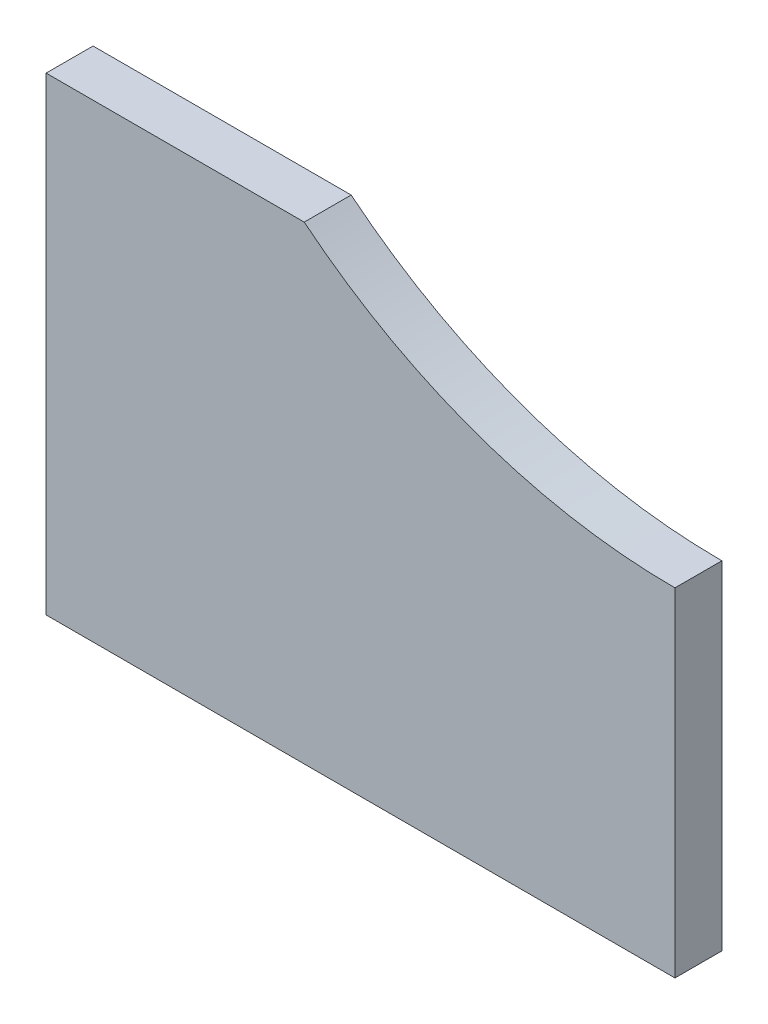
ISO-10303-21;
HEADER;
FILE_DESCRIPTION(('STEP AP214'),'2;1');
FILE_NAME('part.step','',(''),(''),'','','');
FILE_SCHEMA(('AUTOMOTIVE_DESIGN { 1 0 10303 214 1 1 1 1 }'));
ENDSEC;
DATA;
#1=APPLICATION_CONTEXT('core data for automotive mechanical design processes');
#2=APPLICATION_PROTOCOL_DEFINITION('international standard','automotive_design',2000,#1);
#3=PRODUCT_CONTEXT('',#1,'mechanical');
#4=PRODUCT('Part','Part','',(#3));
#5=PRODUCT_RELATED_PRODUCT_CATEGORY('part','',(#4));
#6=PRODUCT_DEFINITION_FORMATION('','',#4);
#7=PRODUCT_DEFINITION_CONTEXT('part definition',#1,'design');
#8=PRODUCT_DEFINITION('design','',#6,#7);
#9=PRODUCT_DEFINITION_SHAPE('','',#8);
#10=(LENGTH_UNIT() NAMED_UNIT(*) SI_UNIT(.MILLI.,.METRE.));
#11=(NAMED_UNIT(*) PLANE_ANGLE_UNIT() SI_UNIT($,.RADIAN.));
#12=(NAMED_UNIT(*) SI_UNIT($,.STERADIAN.) SOLID_ANGLE_UNIT());
#13=UNCERTAINTY_MEASURE_WITH_UNIT(LENGTH_MEASURE(1.E-05),#10,'distance_accuracy_value','');
#14=(GEOMETRIC_REPRESENTATION_CONTEXT(3) GLOBAL_UNCERTAINTY_ASSIGNED_CONTEXT((#13)) GLOBAL_UNIT_ASSIGNED_CONTEXT((#10,
#11,#12)) REPRESENTATION_CONTEXT('',''));
#15=CARTESIAN_POINT('',(0.,0.,0.));
#16=DIRECTION('',(0.,0.,1.));
#17=DIRECTION('',(1.,0.,0.));
#18=AXIS2_PLACEMENT_3D('',#15,#16,#17);
#19=CARTESIAN_POINT('',(-85.09,63.5,6.35));
#20=DIRECTION('',(0.,-1.,0.));
#21=DIRECTION('',(1.,0.,0.));
#22=AXIS2_PLACEMENT_3D('',#19,#20,#21);
#23=PLANE('',#22);
#24=DIRECTION('',(-1.,0.,0.));
#25=VECTOR('',#24,1.);
#26=CARTESIAN_POINT('',(-85.09,63.5,-6.35));
#27=LINE('',#26,#25);
#28=CARTESIAN_POINT('',(-15.24,63.5,-6.35));
#29=VERTEX_POINT('',#28);
#30=CARTESIAN_POINT('',(-85.09,63.5,-6.35));
#31=VERTEX_POINT('',#30);
#32=EDGE_CURVE('E118',#29,#31,#27,.T.);
#33=ORIENTED_EDGE('',*,*,#32,.T.);
#34=DIRECTION('',(0.,0.,-1.));
#35=VECTOR('',#34,1.);
#36=CARTESIAN_POINT('',(-85.09,63.5,6.35));
#37=LINE('',#36,#35);
#38=CARTESIAN_POINT('',(-85.09,63.5,6.35));
#39=VERTEX_POINT('',#38);
#40=EDGE_CURVE('E11',#39,#31,#37,.T.);
#41=ORIENTED_EDGE('',*,*,#40,.F.);
#42=DIRECTION('',(-1.,0.,0.));
#43=VECTOR('',#42,1.);
#44=CARTESIAN_POINT('',(-85.09,63.5,6.35));
#45=LINE('',#44,#43);
#46=CARTESIAN_POINT('',(-15.24,63.5,6.35));
#47=VERTEX_POINT('',#46);
#48=EDGE_CURVE('E131',#47,#39,#45,.T.);
#49=ORIENTED_EDGE('',*,*,#48,.F.);
#50=DIRECTION('',(0.,0.,-1.));
#51=VECTOR('',#50,1.);
#52=CARTESIAN_POINT('',(-15.24,63.5,6.35));
#53=LINE('',#52,#51);
#54=EDGE_CURVE('E114',#47,#29,#53,.T.);
#55=ORIENTED_EDGE('',*,*,#54,.T.);
#56=EDGE_LOOP('',(#33,#41,#49,#55));
#57=FACE_BOUND('',#56,.T.);
#58=ADVANCED_FACE('F39',(#57),#23,.F.);
#59=CARTESIAN_POINT('',(-85.09,63.5,6.35));
#60=DIRECTION('',(1.,0.,0.));
#61=DIRECTION('',(0.,0.,-1.));
#62=AXIS2_PLACEMENT_3D('',#59,#60,#61);
#63=PLANE('',#62);
#64=DIRECTION('',(0.,-1.,0.));
#65=VECTOR('',#64,1.);
#66=CARTESIAN_POINT('',(-85.09,63.5,-6.35));
#67=LINE('',#66,#65);
#68=CARTESIAN_POINT('',(-85.09,-63.5,-6.35));
#69=VERTEX_POINT('',#68);
#70=EDGE_CURVE('E122',#31,#69,#67,.T.);
#71=ORIENTED_EDGE('',*,*,#70,.T.);
#72=DIRECTION('',(0.,0.,-1.));
#73=VECTOR('',#72,1.);
#74=CARTESIAN_POINT('',(-85.09,-63.5,6.35));
#75=LINE('',#74,#73);
#76=CARTESIAN_POINT('',(-85.09,-63.5,6.35));
#77=VERTEX_POINT('',#76);
#78=EDGE_CURVE('E48',#77,#69,#75,.T.);
#79=ORIENTED_EDGE('',*,*,#78,.F.);
#80=DIRECTION('',(0.,-1.,0.));
#81=VECTOR('',#80,1.);
#82=CARTESIAN_POINT('',(-85.09,63.5,6.35));
#83=LINE('',#82,#81);
#84=EDGE_CURVE('E90',#39,#77,#83,.T.);
#85=ORIENTED_EDGE('',*,*,#84,.F.);
#86=ORIENTED_EDGE('',*,*,#40,.T.);
#87=EDGE_LOOP('',(#71,#79,#85,#86));
#88=FACE_BOUND('',#87,.T.);
#89=ADVANCED_FACE('F153',(#88),#63,.F.);
#90=CARTESIAN_POINT('',(-85.09,-63.5,6.35));
#91=DIRECTION('',(0.,1.,0.));
#92=DIRECTION('',(0.,0.,1.));
#93=AXIS2_PLACEMENT_3D('',#90,#91,#92);
#94=PLANE('',#93);
#95=DIRECTION('',(1.,0.,0.));
#96=VECTOR('',#95,1.);
#97=CARTESIAN_POINT('',(-85.09,-63.5,-6.35));
#98=LINE('',#97,#96);
#99=CARTESIAN_POINT('',(85.09,-63.5,-6.35));
#100=VERTEX_POINT('',#99);
#101=EDGE_CURVE('E106',#69,#100,#98,.T.);
#102=ORIENTED_EDGE('',*,*,#101,.T.);
#103=DIRECTION('',(0.,0.,-1.));
#104=VECTOR('',#103,1.);
#105=CARTESIAN_POINT('',(85.09,-63.5,6.35));
#106=LINE('',#105,#104);
#107=CARTESIAN_POINT('',(85.09,-63.5,6.35));
#108=VERTEX_POINT('',#107);
#109=EDGE_CURVE('E103',#108,#100,#106,.T.);
#110=ORIENTED_EDGE('',*,*,#109,.F.);
#111=DIRECTION('',(1.,0.,0.));
#112=VECTOR('',#111,1.);
#113=CARTESIAN_POINT('',(-85.09,-63.5,6.35));
#114=LINE('',#113,#112);
#115=EDGE_CURVE('E94',#77,#108,#114,.T.);
#116=ORIENTED_EDGE('',*,*,#115,.F.);
#117=ORIENTED_EDGE('',*,*,#78,.T.);
#118=EDGE_LOOP('',(#102,#110,#116,#117));
#119=FACE_BOUND('',#118,.T.);
#120=ADVANCED_FACE('F104',(#119),#94,.F.);
#121=CARTESIAN_POINT('',(85.09,-63.5,6.35));
#122=DIRECTION('',(-1.,0.,0.));
#123=DIRECTION('',(0.,0.,1.));
#124=AXIS2_PLACEMENT_3D('',#121,#122,#123);
#125=PLANE('',#124);
#126=DIRECTION('',(0.,1.,0.));
#127=VECTOR('',#126,1.);
#128=CARTESIAN_POINT('',(85.09,-63.5,-6.35));
#129=LINE('',#128,#127);
#130=CARTESIAN_POINT('',(85.09,27.94,-6.35));
#131=VERTEX_POINT('',#130);
#132=EDGE_CURVE('E76',#100,#131,#129,.T.);
#133=ORIENTED_EDGE('',*,*,#132,.T.);
#134=DIRECTION('',(0.,0.,-1.));
#135=VECTOR('',#134,1.);
#136=CARTESIAN_POINT('',(85.09,27.94,6.35));
#137=LINE('',#136,#135);
#138=CARTESIAN_POINT('',(85.09,27.94,6.35));
#139=VERTEX_POINT('',#138);
#140=EDGE_CURVE('E108',#139,#131,#137,.T.);
#141=ORIENTED_EDGE('',*,*,#140,.F.);
#142=DIRECTION('',(0.,1.,0.));
#143=VECTOR('',#142,1.);
#144=CARTESIAN_POINT('',(85.09,-63.5,6.35));
#145=LINE('',#144,#143);
#146=EDGE_CURVE('E98',#108,#139,#145,.T.);
#147=ORIENTED_EDGE('',*,*,#146,.F.);
#148=ORIENTED_EDGE('',*,*,#109,.T.);
#149=EDGE_LOOP('',(#133,#141,#147,#148));
#150=FACE_BOUND('',#149,.T.);
#151=ADVANCED_FACE('F110',(#150),#125,.F.);
#152=CARTESIAN_POINT('',(85.09,187.256964285714,6.35));
#153=DIRECTION('',(0.,0.,-1.));
#154=DIRECTION('',(-1.,0.,0.));
#155=AXIS2_PLACEMENT_3D('',#152,#153,#154);
#156=CYLINDRICAL_SURFACE('',#155,159.316964285714);
#157=CARTESIAN_POINT('',(85.09,187.256964285714,-6.35));
#158=DIRECTION('',(0.,0.,-1.));
#159=DIRECTION('',(1.,0.,0.));
#160=AXIS2_PLACEMENT_3D('',#157,#158,#159);
#161=CIRCLE('',#160,159.316964285714);
#162=EDGE_CURVE('E82',#131,#29,#161,.T.);
#163=ORIENTED_EDGE('',*,*,#162,.T.);
#164=ORIENTED_EDGE('',*,*,#54,.F.);
#165=CARTESIAN_POINT('',(85.09,187.256964285714,6.35));
#166=DIRECTION('',(0.,0.,-1.));
#167=DIRECTION('',(1.,0.,0.));
#168=AXIS2_PLACEMENT_3D('',#165,#166,#167);
#169=CIRCLE('',#168,159.316964285714);
#170=EDGE_CURVE('E56',#139,#47,#169,.T.);
#171=ORIENTED_EDGE('',*,*,#170,.F.);
#172=ORIENTED_EDGE('',*,*,#140,.T.);
#173=EDGE_LOOP('',(#163,#164,#171,#172));
#174=FACE_BOUND('',#173,.T.);
#175=ADVANCED_FACE('F142',(#174),#156,.F.);
#176=CARTESIAN_POINT('',(85.09,187.256964285714,6.35));
#177=DIRECTION('',(0.,0.,1.));
#178=DIRECTION('',(1.,0.,0.));
#179=AXIS2_PLACEMENT_3D('',#176,#177,#178);
#180=PLANE('',#179);
#181=ORIENTED_EDGE('',*,*,#48,.T.);
#182=ORIENTED_EDGE('',*,*,#84,.T.);
#183=ORIENTED_EDGE('',*,*,#115,.T.);
#184=ORIENTED_EDGE('',*,*,#146,.T.);
#185=ORIENTED_EDGE('',*,*,#170,.T.);
#186=EDGE_LOOP('',(#181,#182,#183,#184,#185));
#187=FACE_BOUND('',#186,.T.);
#188=ADVANCED_FACE('F96',(#187),#180,.T.);
#189=CARTESIAN_POINT('',(85.09,187.256964285714,-6.35));
#190=DIRECTION('',(0.,0.,1.));
#191=DIRECTION('',(1.,0.,0.));
#192=AXIS2_PLACEMENT_3D('',#189,#190,#191);
#193=PLANE('',#192);
#194=ORIENTED_EDGE('',*,*,#32,.F.);
#195=ORIENTED_EDGE('',*,*,#162,.F.);
#196=ORIENTED_EDGE('',*,*,#132,.F.);
#197=ORIENTED_EDGE('',*,*,#101,.F.);
#198=ORIENTED_EDGE('',*,*,#70,.F.);
#199=EDGE_LOOP('',(#194,#195,#196,#197,#198));
#200=FACE_BOUND('',#199,.T.);
#201=ADVANCED_FACE('F138',(#200),#193,.F.);
#202=CLOSED_SHELL('',(#58,#89,#120,#151,#175,#188,#201));
#203=MANIFOLD_SOLID_BREP('B2',#202);
#204=ADVANCED_BREP_SHAPE_REPRESENTATION('',(#18,#203),#14);
#205=SHAPE_DEFINITION_REPRESENTATION(#9,#204);
ENDSEC;
END-ISO-10303-21;
